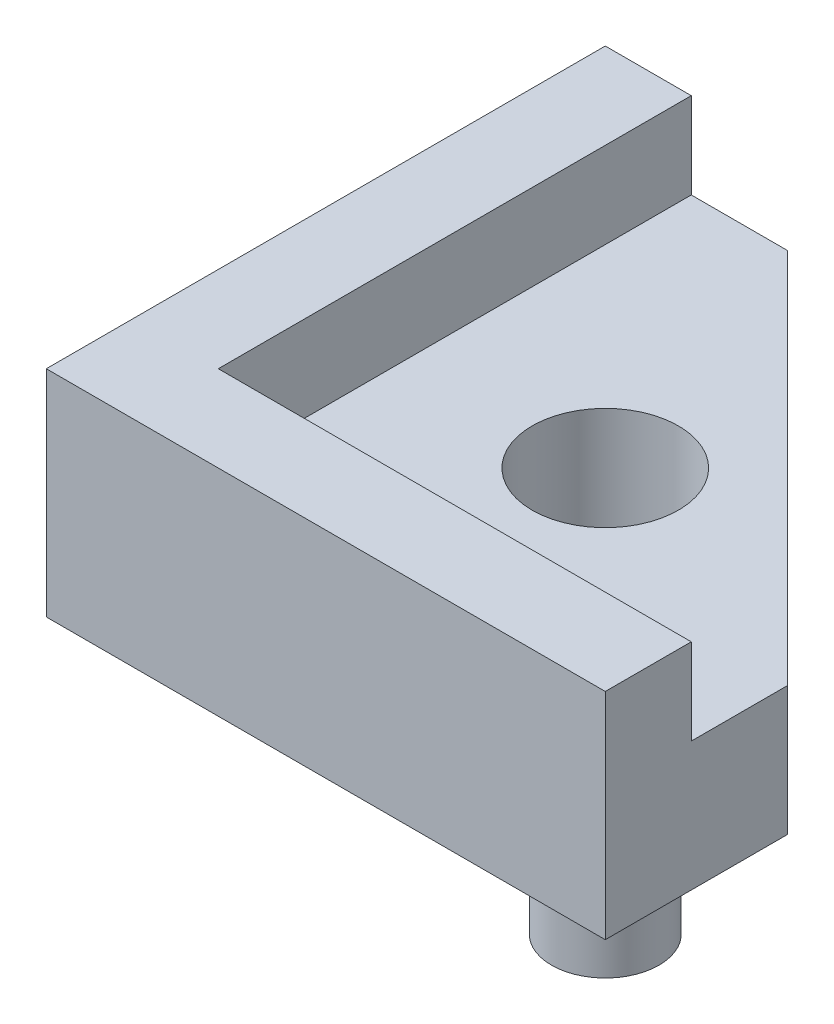
ISO-10303-21;
HEADER;
FILE_DESCRIPTION(('STEP AP214'),'2;1');
FILE_NAME('part.step','',(''),(''),'','','');
FILE_SCHEMA(('AUTOMOTIVE_DESIGN { 1 0 10303 214 1 1 1 1 }'));
ENDSEC;
DATA;
#1=APPLICATION_CONTEXT('core data for automotive mechanical design processes');
#2=APPLICATION_PROTOCOL_DEFINITION('international standard','automotive_design',2000,#1);
#3=PRODUCT_CONTEXT('',#1,'mechanical');
#4=PRODUCT('Part','Part','',(#3));
#5=PRODUCT_RELATED_PRODUCT_CATEGORY('part','',(#4));
#6=PRODUCT_DEFINITION_FORMATION('','',#4);
#7=PRODUCT_DEFINITION_CONTEXT('part definition',#1,'design');
#8=PRODUCT_DEFINITION('design','',#6,#7);
#9=PRODUCT_DEFINITION_SHAPE('','',#8);
#10=(LENGTH_UNIT() NAMED_UNIT(*) SI_UNIT(.MILLI.,.METRE.));
#11=(NAMED_UNIT(*) PLANE_ANGLE_UNIT() SI_UNIT($,.RADIAN.));
#12=(NAMED_UNIT(*) SI_UNIT($,.STERADIAN.) SOLID_ANGLE_UNIT());
#13=UNCERTAINTY_MEASURE_WITH_UNIT(LENGTH_MEASURE(1.E-05),#10,'distance_accuracy_value','');
#14=(GEOMETRIC_REPRESENTATION_CONTEXT(3) GLOBAL_UNCERTAINTY_ASSIGNED_CONTEXT((#13)) GLOBAL_UNIT_ASSIGNED_CONTEXT((#10,
#11,#12)) REPRESENTATION_CONTEXT('',''));
#15=CARTESIAN_POINT('',(0.,0.,0.));
#16=DIRECTION('',(0.,0.,1.));
#17=DIRECTION('',(1.,0.,0.));
#18=AXIS2_PLACEMENT_3D('',#15,#16,#17);
#19=CARTESIAN_POINT('',(-2.5,-3.,2.5));
#20=DIRECTION('',(0.,0.,1.));
#21=DIRECTION('',(1.,0.,0.));
#22=AXIS2_PLACEMENT_3D('',#19,#20,#21);
#23=PLANE('',#22);
#24=DIRECTION('',(0.,1.,0.));
#25=VECTOR('',#24,1.);
#26=CARTESIAN_POINT('',(10.5,-3.,2.5));
#27=LINE('',#26,#25);
#28=CARTESIAN_POINT('',(10.5,-3.,2.5));
#29=VERTEX_POINT('',#28);
#30=CARTESIAN_POINT('',(10.5,2.,2.5));
#31=VERTEX_POINT('',#30);
#32=EDGE_CURVE('E196',#29,#31,#27,.T.);
#33=ORIENTED_EDGE('',*,*,#32,.T.);
#34=DIRECTION('',(1.,0.,0.));
#35=VECTOR('',#34,1.);
#36=CARTESIAN_POINT('',(-2.5,2.,2.5));
#37=LINE('',#36,#35);
#38=CARTESIAN_POINT('',(-2.5,2.,2.5));
#39=VERTEX_POINT('',#38);
#40=EDGE_CURVE('E132',#39,#31,#37,.T.);
#41=ORIENTED_EDGE('',*,*,#40,.F.);
#42=DIRECTION('',(0.,1.,0.));
#43=VECTOR('',#42,1.);
#44=CARTESIAN_POINT('',(-2.5,-3.,2.5));
#45=LINE('',#44,#43);
#46=CARTESIAN_POINT('',(-2.5,-3.,2.5));
#47=VERTEX_POINT('',#46);
#48=EDGE_CURVE('E122',#47,#39,#45,.T.);
#49=ORIENTED_EDGE('',*,*,#48,.F.);
#50=DIRECTION('',(1.,0.,0.));
#51=VECTOR('',#50,1.);
#52=CARTESIAN_POINT('',(-2.5,-3.,2.5));
#53=LINE('',#52,#51);
#54=EDGE_CURVE('E179',#47,#29,#53,.T.);
#55=ORIENTED_EDGE('',*,*,#54,.T.);
#56=EDGE_LOOP('',(#33,#41,#49,#55));
#57=FACE_BOUND('',#56,.T.);
#58=ADVANCED_FACE('F45',(#57),#23,.T.);
#59=CARTESIAN_POINT('',(-2.5,-3.,-10.5));
#60=DIRECTION('',(-1.,0.,0.));
#61=DIRECTION('',(0.,0.,1.));
#62=AXIS2_PLACEMENT_3D('',#59,#60,#61);
#63=PLANE('',#62);
#64=ORIENTED_EDGE('',*,*,#48,.T.);
#65=DIRECTION('',(0.,0.,1.));
#66=VECTOR('',#65,1.);
#67=CARTESIAN_POINT('',(-2.5,2.,-10.5));
#68=LINE('',#67,#66);
#69=CARTESIAN_POINT('',(-2.5,2.,-10.5));
#70=VERTEX_POINT('',#69);
#71=EDGE_CURVE('E126',#70,#39,#68,.T.);
#72=ORIENTED_EDGE('',*,*,#71,.F.);
#73=DIRECTION('',(0.,1.,0.));
#74=VECTOR('',#73,1.);
#75=CARTESIAN_POINT('',(-2.5,-3.,-10.5));
#76=LINE('',#75,#74);
#77=CARTESIAN_POINT('',(-2.5,-3.,-10.5));
#78=VERTEX_POINT('',#77);
#79=EDGE_CURVE('E110',#78,#70,#76,.T.);
#80=ORIENTED_EDGE('',*,*,#79,.F.);
#81=DIRECTION('',(0.,0.,1.));
#82=VECTOR('',#81,1.);
#83=CARTESIAN_POINT('',(-2.5,-3.,-10.5));
#84=LINE('',#83,#82);
#85=EDGE_CURVE('E193',#78,#47,#84,.T.);
#86=ORIENTED_EDGE('',*,*,#85,.T.);
#87=EDGE_LOOP('',(#64,#72,#80,#86));
#88=FACE_BOUND('',#87,.T.);
#89=ADVANCED_FACE('F127',(#88),#63,.T.);
#90=CARTESIAN_POINT('',(1.74264068711924,-3.,-10.5));
#91=DIRECTION('',(0.,0.,-1.));
#92=DIRECTION('',(-1.,0.,0.));
#93=AXIS2_PLACEMENT_3D('',#90,#91,#92);
#94=PLANE('',#93);
#95=DIRECTION('',(-1.,0.,0.));
#96=VECTOR('',#95,1.);
#97=CARTESIAN_POINT('',(1.74264068711924,0.,-10.5));
#98=LINE('',#97,#96);
#99=CARTESIAN_POINT('',(1.74264068711924,0.,-10.5));
#100=VERTEX_POINT('',#99);
#101=CARTESIAN_POINT('',(-0.5,0.,-10.5));
#102=VERTEX_POINT('',#101);
#103=EDGE_CURVE('E60',#100,#102,#98,.T.);
#104=ORIENTED_EDGE('',*,*,#103,.F.);
#105=DIRECTION('',(0.,1.,0.));
#106=VECTOR('',#105,1.);
#107=CARTESIAN_POINT('',(1.74264068711924,-3.,-10.5));
#108=LINE('',#107,#106);
#109=CARTESIAN_POINT('',(1.74264068711924,-3.,-10.5));
#110=VERTEX_POINT('',#109);
#111=EDGE_CURVE('E123',#110,#100,#108,.T.);
#112=ORIENTED_EDGE('',*,*,#111,.F.);
#113=DIRECTION('',(-1.,0.,0.));
#114=VECTOR('',#113,1.);
#115=CARTESIAN_POINT('',(1.74264068711924,-3.,-10.5));
#116=LINE('',#115,#114);
#117=EDGE_CURVE('E117',#110,#78,#116,.T.);
#118=ORIENTED_EDGE('',*,*,#117,.T.);
#119=ORIENTED_EDGE('',*,*,#79,.T.);
#120=DIRECTION('',(-1.,0.,0.));
#121=VECTOR('',#120,1.);
#122=CARTESIAN_POINT('',(-0.5,2.,-10.5));
#123=LINE('',#122,#121);
#124=CARTESIAN_POINT('',(-0.5,2.,-10.5));
#125=VERTEX_POINT('',#124);
#126=EDGE_CURVE('E115',#125,#70,#123,.T.);
#127=ORIENTED_EDGE('',*,*,#126,.F.);
#128=DIRECTION('',(0.,-1.,0.));
#129=VECTOR('',#128,1.);
#130=CARTESIAN_POINT('',(-0.5,2.,-10.5));
#131=LINE('',#130,#129);
#132=EDGE_CURVE('E157',#125,#102,#131,.T.);
#133=ORIENTED_EDGE('',*,*,#132,.T.);
#134=EDGE_LOOP('',(#104,#112,#118,#119,#127,#133));
#135=FACE_BOUND('',#134,.T.);
#136=ADVANCED_FACE('F112',(#135),#94,.T.);
#137=CARTESIAN_POINT('',(10.5,-3.,-1.74264068711933));
#138=DIRECTION('',(0.707106781186544,0.,-0.707106781186551));
#139=DIRECTION('',(-0.707106781186551,0.,-0.707106781186544));
#140=AXIS2_PLACEMENT_3D('',#137,#138,#139);
#141=PLANE('',#140);
#142=DIRECTION('',(-0.707106781186551,0.,-0.707106781186544));
#143=VECTOR('',#142,1.);
#144=CARTESIAN_POINT('',(10.5,0.,-1.74264068711933));
#145=LINE('',#144,#143);
#146=CARTESIAN_POINT('',(10.5,0.,-1.74264068711933));
#147=VERTEX_POINT('',#146);
#148=EDGE_CURVE('E199',#147,#100,#145,.T.);
#149=ORIENTED_EDGE('',*,*,#148,.F.);
#150=DIRECTION('',(0.,1.,0.));
#151=VECTOR('',#150,1.);
#152=CARTESIAN_POINT('',(10.5,-3.,-1.74264068711933));
#153=LINE('',#152,#151);
#154=CARTESIAN_POINT('',(10.5,-3.,-1.74264068711933));
#155=VERTEX_POINT('',#154);
#156=EDGE_CURVE('E208',#155,#147,#153,.T.);
#157=ORIENTED_EDGE('',*,*,#156,.F.);
#158=DIRECTION('',(-0.707106781186551,0.,-0.707106781186544));
#159=VECTOR('',#158,1.);
#160=CARTESIAN_POINT('',(10.5,-3.,-1.74264068711933));
#161=LINE('',#160,#159);
#162=EDGE_CURVE('E187',#155,#110,#161,.T.);
#163=ORIENTED_EDGE('',*,*,#162,.T.);
#164=ORIENTED_EDGE('',*,*,#111,.T.);
#165=EDGE_LOOP('',(#149,#157,#163,#164));
#166=FACE_BOUND('',#165,.T.);
#167=ADVANCED_FACE('F241',(#166),#141,.T.);
#168=CARTESIAN_POINT('',(10.5,-3.,2.5));
#169=DIRECTION('',(1.,0.,0.));
#170=DIRECTION('',(0.,0.,-1.));
#171=AXIS2_PLACEMENT_3D('',#168,#169,#170);
#172=PLANE('',#171);
#173=DIRECTION('',(0.,0.,-1.));
#174=VECTOR('',#173,1.);
#175=CARTESIAN_POINT('',(10.5,0.,2.5));
#176=LINE('',#175,#174);
#177=CARTESIAN_POINT('',(10.5,0.,0.500000000000001));
#178=VERTEX_POINT('',#177);
#179=EDGE_CURVE('E178',#178,#147,#176,.T.);
#180=ORIENTED_EDGE('',*,*,#179,.F.);
#181=DIRECTION('',(0.,-1.,0.));
#182=VECTOR('',#181,1.);
#183=CARTESIAN_POINT('',(10.5,2.,0.5));
#184=LINE('',#183,#182);
#185=CARTESIAN_POINT('',(10.5,2.,0.5));
#186=VERTEX_POINT('',#185);
#187=EDGE_CURVE('E166',#186,#178,#184,.T.);
#188=ORIENTED_EDGE('',*,*,#187,.F.);
#189=DIRECTION('',(0.,0.,-1.));
#190=VECTOR('',#189,1.);
#191=CARTESIAN_POINT('',(10.5,2.,2.5));
#192=LINE('',#191,#190);
#193=EDGE_CURVE('E149',#31,#186,#192,.T.);
#194=ORIENTED_EDGE('',*,*,#193,.F.);
#195=ORIENTED_EDGE('',*,*,#32,.F.);
#196=DIRECTION('',(0.,0.,-1.));
#197=VECTOR('',#196,1.);
#198=CARTESIAN_POINT('',(10.5,-3.,2.5));
#199=LINE('',#198,#197);
#200=EDGE_CURVE('E183',#29,#155,#199,.T.);
#201=ORIENTED_EDGE('',*,*,#200,.T.);
#202=ORIENTED_EDGE('',*,*,#156,.T.);
#203=EDGE_LOOP('',(#180,#188,#194,#195,#201,#202));
#204=FACE_BOUND('',#203,.T.);
#205=ADVANCED_FACE('F223',(#204),#172,.T.);
#206=CARTESIAN_POINT('',(0.,-3.,0.));
#207=DIRECTION('',(0.,1.,0.));
#208=DIRECTION('',(0.,0.,1.));
#209=AXIS2_PLACEMENT_3D('',#206,#207,#208);
#210=PLANE('',#209);
#211=CARTESIAN_POINT('',(4.,-3.,-4.));
#212=DIRECTION('',(0.,1.,0.));
#213=DIRECTION('',(0.,0.,1.));
#214=AXIS2_PLACEMENT_3D('',#211,#212,#213);
#215=CIRCLE('',#214,1.7);
#216=CARTESIAN_POINT('',(4.,-3.,-2.3));
#217=VERTEX_POINT('',#216);
#218=EDGE_CURVE('E144',#217,#217,#215,.F.);
#219=ORIENTED_EDGE('',*,*,#218,.F.);
#220=EDGE_LOOP('',(#219));
#221=FACE_BOUND('',#220,.T.);
#222=CARTESIAN_POINT('',(0.11091270347399,-3.,-7.88908729652601));
#223=DIRECTION('',(0.,1.,0.));
#224=DIRECTION('',(0.,0.,1.));
#225=AXIS2_PLACEMENT_3D('',#222,#223,#224);
#226=CIRCLE('',#225,1.25);
#227=CARTESIAN_POINT('',(0.11091270347399,-3.,-6.63908729652601));
#228=VERTEX_POINT('',#227);
#229=EDGE_CURVE('E11',#228,#228,#226,.F.);
#230=ORIENTED_EDGE('',*,*,#229,.F.);
#231=EDGE_LOOP('',(#230));
#232=FACE_BOUND('',#231,.T.);
#233=CARTESIAN_POINT('',(7.88908729652601,-3.,-0.110912703473988));
#234=DIRECTION('',(0.,1.,0.));
#235=DIRECTION('',(0.,0.,1.));
#236=AXIS2_PLACEMENT_3D('',#233,#234,#235);
#237=CIRCLE('',#236,1.25);
#238=CARTESIAN_POINT('',(7.88908729652601,-3.,1.13908729652601));
#239=VERTEX_POINT('',#238);
#240=EDGE_CURVE('E53',#239,#239,#237,.F.);
#241=ORIENTED_EDGE('',*,*,#240,.F.);
#242=EDGE_LOOP('',(#241));
#243=FACE_BOUND('',#242,.T.);
#244=ORIENTED_EDGE('',*,*,#54,.F.);
#245=ORIENTED_EDGE('',*,*,#85,.F.);
#246=ORIENTED_EDGE('',*,*,#117,.F.);
#247=ORIENTED_EDGE('',*,*,#162,.F.);
#248=ORIENTED_EDGE('',*,*,#200,.F.);
#249=EDGE_LOOP('',(#244,#245,#246,#247,#248));
#250=FACE_BOUND('',#249,.T.);
#251=ADVANCED_FACE('F219',(#221,#232,#243,#250),#210,.F.);
#252=CARTESIAN_POINT('',(0.,0.,0.));
#253=DIRECTION('',(0.,1.,0.));
#254=DIRECTION('',(0.,0.,1.));
#255=AXIS2_PLACEMENT_3D('',#252,#253,#254);
#256=PLANE('',#255);
#257=CARTESIAN_POINT('',(4.,0.,-4.));
#258=DIRECTION('',(0.,1.,0.));
#259=DIRECTION('',(0.,0.,1.));
#260=AXIS2_PLACEMENT_3D('',#257,#258,#259);
#261=CIRCLE('',#260,1.7);
#262=CARTESIAN_POINT('',(4.,0.,-2.3));
#263=VERTEX_POINT('',#262);
#264=EDGE_CURVE('E289',#263,#263,#261,.T.);
#265=ORIENTED_EDGE('',*,*,#264,.F.);
#266=EDGE_LOOP('',(#265));
#267=FACE_BOUND('',#266,.T.);
#268=DIRECTION('',(0.,0.,-1.));
#269=VECTOR('',#268,1.);
#270=CARTESIAN_POINT('',(-0.5,0.,0.500000000000001));
#271=LINE('',#270,#269);
#272=CARTESIAN_POINT('',(-0.5,0.,0.500000000000001));
#273=VERTEX_POINT('',#272);
#274=EDGE_CURVE('E139',#273,#102,#271,.T.);
#275=ORIENTED_EDGE('',*,*,#274,.F.);
#276=DIRECTION('',(-1.,0.,0.));
#277=VECTOR('',#276,1.);
#278=CARTESIAN_POINT('',(10.5,0.,0.5));
#279=LINE('',#278,#277);
#280=EDGE_CURVE('E66',#178,#273,#279,.T.);
#281=ORIENTED_EDGE('',*,*,#280,.F.);
#282=ORIENTED_EDGE('',*,*,#179,.T.);
#283=ORIENTED_EDGE('',*,*,#148,.T.);
#284=ORIENTED_EDGE('',*,*,#103,.T.);
#285=EDGE_LOOP('',(#275,#281,#282,#283,#284));
#286=FACE_BOUND('',#285,.T.);
#287=ADVANCED_FACE('F222',(#267,#286),#256,.T.);
#288=CARTESIAN_POINT('',(7.88908729652601,-5.5,-0.110912703473988));
#289=DIRECTION('',(0.,1.,0.));
#290=DIRECTION('',(0.,0.,1.));
#291=AXIS2_PLACEMENT_3D('',#288,#289,#290);
#292=CYLINDRICAL_SURFACE('',#291,1.25);
#293=CARTESIAN_POINT('',(7.88908729652601,-5.5,-0.110912703473988));
#294=DIRECTION('',(0.,-1.,0.));
#295=DIRECTION('',(0.,0.,-1.));
#296=AXIS2_PLACEMENT_3D('',#293,#294,#295);
#297=CIRCLE('',#296,1.25);
#298=CARTESIAN_POINT('',(7.88908729652601,-5.5,-1.36091270347399));
#299=VERTEX_POINT('',#298);
#300=EDGE_CURVE('E174',#299,#299,#297,.T.);
#301=ORIENTED_EDGE('',*,*,#300,.F.);
#302=EDGE_LOOP('',(#301));
#303=FACE_BOUND('',#302,.T.);
#304=ORIENTED_EDGE('',*,*,#240,.T.);
#305=EDGE_LOOP('',(#304));
#306=FACE_BOUND('',#305,.T.);
#307=ADVANCED_FACE('F217',(#303,#306),#292,.T.);
#308=CARTESIAN_POINT('',(7.88908729652601,-5.5,-0.110912703473988));
#309=DIRECTION('',(0.,-1.,0.));
#310=DIRECTION('',(0.,0.,-1.));
#311=AXIS2_PLACEMENT_3D('',#308,#309,#310);
#312=PLANE('',#311);
#313=ORIENTED_EDGE('',*,*,#300,.T.);
#314=EDGE_LOOP('',(#313));
#315=FACE_BOUND('',#314,.T.);
#316=ADVANCED_FACE('F263',(#315),#312,.T.);
#317=CARTESIAN_POINT('',(0.11091270347399,-5.5,-7.88908729652601));
#318=DIRECTION('',(0.,1.,0.));
#319=DIRECTION('',(0.,0.,1.));
#320=AXIS2_PLACEMENT_3D('',#317,#318,#319);
#321=CYLINDRICAL_SURFACE('',#320,1.25);
#322=CARTESIAN_POINT('',(0.11091270347399,-5.5,-7.88908729652601));
#323=DIRECTION('',(0.,-1.,0.));
#324=DIRECTION('',(0.,0.,-1.));
#325=AXIS2_PLACEMENT_3D('',#322,#323,#324);
#326=CIRCLE('',#325,1.25);
#327=CARTESIAN_POINT('',(0.11091270347399,-5.5,-9.13908729652601));
#328=VERTEX_POINT('',#327);
#329=EDGE_CURVE('E170',#328,#328,#326,.T.);
#330=ORIENTED_EDGE('',*,*,#329,.F.);
#331=EDGE_LOOP('',(#330));
#332=FACE_BOUND('',#331,.T.);
#333=ORIENTED_EDGE('',*,*,#229,.T.);
#334=EDGE_LOOP('',(#333));
#335=FACE_BOUND('',#334,.T.);
#336=ADVANCED_FACE('F267',(#332,#335),#321,.T.);
#337=CARTESIAN_POINT('',(0.11091270347399,-5.5,-7.88908729652601));
#338=DIRECTION('',(0.,-1.,0.));
#339=DIRECTION('',(0.,0.,-1.));
#340=AXIS2_PLACEMENT_3D('',#337,#338,#339);
#341=PLANE('',#340);
#342=ORIENTED_EDGE('',*,*,#329,.T.);
#343=EDGE_LOOP('',(#342));
#344=FACE_BOUND('',#343,.T.);
#345=ADVANCED_FACE('F269',(#344),#341,.T.);
#346=CARTESIAN_POINT('',(10.5,2.,0.5));
#347=DIRECTION('',(0.,0.,1.));
#348=DIRECTION('',(1.,0.,0.));
#349=AXIS2_PLACEMENT_3D('',#346,#347,#348);
#350=PLANE('',#349);
#351=ORIENTED_EDGE('',*,*,#280,.T.);
#352=DIRECTION('',(0.,-1.,0.));
#353=VECTOR('',#352,1.);
#354=CARTESIAN_POINT('',(-0.5,2.,0.500000000000001));
#355=LINE('',#354,#353);
#356=CARTESIAN_POINT('',(-0.5,2.,0.500000000000001));
#357=VERTEX_POINT('',#356);
#358=EDGE_CURVE('E162',#357,#273,#355,.T.);
#359=ORIENTED_EDGE('',*,*,#358,.F.);
#360=DIRECTION('',(-1.,0.,0.));
#361=VECTOR('',#360,1.);
#362=CARTESIAN_POINT('',(10.5,2.,0.5));
#363=LINE('',#362,#361);
#364=EDGE_CURVE('E152',#186,#357,#363,.T.);
#365=ORIENTED_EDGE('',*,*,#364,.F.);
#366=ORIENTED_EDGE('',*,*,#187,.T.);
#367=EDGE_LOOP('',(#351,#359,#365,#366));
#368=FACE_BOUND('',#367,.T.);
#369=ADVANCED_FACE('F236',(#368),#350,.F.);
#370=CARTESIAN_POINT('',(-0.5,2.,0.500000000000001));
#371=DIRECTION('',(-1.,0.,0.));
#372=DIRECTION('',(0.,0.,1.));
#373=AXIS2_PLACEMENT_3D('',#370,#371,#372);
#374=PLANE('',#373);
#375=ORIENTED_EDGE('',*,*,#274,.T.);
#376=ORIENTED_EDGE('',*,*,#132,.F.);
#377=DIRECTION('',(0.,0.,-1.));
#378=VECTOR('',#377,1.);
#379=CARTESIAN_POINT('',(-0.5,2.,0.500000000000001));
#380=LINE('',#379,#378);
#381=EDGE_CURVE('E136',#357,#125,#380,.T.);
#382=ORIENTED_EDGE('',*,*,#381,.F.);
#383=ORIENTED_EDGE('',*,*,#358,.T.);
#384=EDGE_LOOP('',(#375,#376,#382,#383));
#385=FACE_BOUND('',#384,.T.);
#386=ADVANCED_FACE('F238',(#385),#374,.F.);
#387=CARTESIAN_POINT('',(0.,2.,0.));
#388=DIRECTION('',(0.,1.,0.));
#389=DIRECTION('',(0.,0.,1.));
#390=AXIS2_PLACEMENT_3D('',#387,#388,#389);
#391=PLANE('',#390);
#392=ORIENTED_EDGE('',*,*,#126,.T.);
#393=ORIENTED_EDGE('',*,*,#71,.T.);
#394=ORIENTED_EDGE('',*,*,#40,.T.);
#395=ORIENTED_EDGE('',*,*,#193,.T.);
#396=ORIENTED_EDGE('',*,*,#364,.T.);
#397=ORIENTED_EDGE('',*,*,#381,.T.);
#398=EDGE_LOOP('',(#392,#393,#394,#395,#396,#397));
#399=FACE_BOUND('',#398,.T.);
#400=ADVANCED_FACE('F134',(#399),#391,.T.);
#401=CARTESIAN_POINT('',(4.,-5.501,-4.));
#402=DIRECTION('',(0.,1.,0.));
#403=DIRECTION('',(0.,0.,1.));
#404=AXIS2_PLACEMENT_3D('',#401,#402,#403);
#405=CYLINDRICAL_SURFACE('',#404,1.7);
#406=CARTESIAN_POINT('',(4.,0.,-2.3));
#407=CARTESIAN_POINT('',(4.,-0.03125,-2.3));
#408=CARTESIAN_POINT('',(4.,-0.0625000000000001,-2.3));
#409=CARTESIAN_POINT('',(4.,-0.125,-2.3));
#410=CARTESIAN_POINT('',(4.,-0.15625,-2.3));
#411=CARTESIAN_POINT('',(4.,-0.21875,-2.3));
#412=CARTESIAN_POINT('',(4.,-0.25,-2.3));
#413=CARTESIAN_POINT('',(4.,-0.3125,-2.3));
#414=CARTESIAN_POINT('',(4.,-0.34375,-2.3));
#415=CARTESIAN_POINT('',(4.,-0.40625,-2.3));
#416=CARTESIAN_POINT('',(4.,-0.4375,-2.3));
#417=CARTESIAN_POINT('',(4.,-0.5,-2.3));
#418=CARTESIAN_POINT('',(4.,-0.53125,-2.3));
#419=CARTESIAN_POINT('',(4.,-0.593750000000001,-2.3));
#420=CARTESIAN_POINT('',(4.,-0.625000000000001,-2.3));
#421=CARTESIAN_POINT('',(4.,-0.687500000000001,-2.3));
#422=CARTESIAN_POINT('',(4.,-0.718750000000001,-2.3));
#423=CARTESIAN_POINT('',(4.,-0.781250000000001,-2.3));
#424=CARTESIAN_POINT('',(4.,-0.812500000000001,-2.3));
#425=CARTESIAN_POINT('',(4.,-0.875,-2.3));
#426=CARTESIAN_POINT('',(4.,-0.90625,-2.3));
#427=CARTESIAN_POINT('',(4.,-0.96875,-2.3));
#428=CARTESIAN_POINT('',(4.,-1.,-2.3));
#429=CARTESIAN_POINT('',(4.,-1.0625,-2.3));
#430=CARTESIAN_POINT('',(4.,-1.09375,-2.3));
#431=CARTESIAN_POINT('',(4.,-1.15625,-2.3));
#432=CARTESIAN_POINT('',(4.,-1.1875,-2.3));
#433=CARTESIAN_POINT('',(4.,-1.25,-2.3));
#434=CARTESIAN_POINT('',(4.,-1.28125,-2.3));
#435=CARTESIAN_POINT('',(4.,-1.34375,-2.3));
#436=CARTESIAN_POINT('',(4.,-1.375,-2.3));
#437=CARTESIAN_POINT('',(4.,-1.4375,-2.3));
#438=CARTESIAN_POINT('',(4.,-1.46875,-2.3));
#439=CARTESIAN_POINT('',(4.,-1.53125,-2.3));
#440=CARTESIAN_POINT('',(4.,-1.5625,-2.3));
#441=CARTESIAN_POINT('',(4.,-1.625,-2.3));
#442=CARTESIAN_POINT('',(4.,-1.65625,-2.3));
#443=CARTESIAN_POINT('',(4.,-1.71875,-2.3));
#444=CARTESIAN_POINT('',(4.,-1.75,-2.3));
#445=CARTESIAN_POINT('',(4.,-1.8125,-2.3));
#446=CARTESIAN_POINT('',(4.,-1.84375,-2.3));
#447=CARTESIAN_POINT('',(4.,-1.90625,-2.3));
#448=CARTESIAN_POINT('',(4.,-1.9375,-2.3));
#449=CARTESIAN_POINT('',(4.,-2.,-2.3));
#450=CARTESIAN_POINT('',(4.,-2.03125,-2.3));
#451=CARTESIAN_POINT('',(4.,-2.09375,-2.3));
#452=CARTESIAN_POINT('',(4.,-2.125,-2.3));
#453=CARTESIAN_POINT('',(4.,-2.1875,-2.3));
#454=CARTESIAN_POINT('',(4.,-2.21875,-2.3));
#455=CARTESIAN_POINT('',(4.,-2.28125,-2.3));
#456=CARTESIAN_POINT('',(4.,-2.3125,-2.3));
#457=CARTESIAN_POINT('',(4.,-2.375,-2.3));
#458=CARTESIAN_POINT('',(4.,-2.40625,-2.3));
#459=CARTESIAN_POINT('',(4.,-2.46875,-2.3));
#460=CARTESIAN_POINT('',(4.,-2.5,-2.3));
#461=CARTESIAN_POINT('',(4.,-2.5625,-2.3));
#462=CARTESIAN_POINT('',(4.,-2.59375,-2.3));
#463=CARTESIAN_POINT('',(4.,-2.65625,-2.3));
#464=CARTESIAN_POINT('',(4.,-2.6875,-2.3));
#465=CARTESIAN_POINT('',(4.,-2.75,-2.3));
#466=CARTESIAN_POINT('',(4.,-2.78125,-2.3));
#467=CARTESIAN_POINT('',(4.,-2.84375,-2.3));
#468=CARTESIAN_POINT('',(4.,-2.875,-2.3));
#469=CARTESIAN_POINT('',(4.,-2.9375,-2.3));
#470=CARTESIAN_POINT('',(4.,-2.96875,-2.3));
#471=CARTESIAN_POINT('',(4.,-3.,-2.3));
#472=B_SPLINE_CURVE_WITH_KNOTS('',3,(#406,#407,#408,#409,#410,#411,#412,#413,#414,#415,#416,
#417,#418,#419,#420,#421,#422,#423,#424,#425,#426,#427,#428,#429,#430,#431,#432,#433,#434,#435,
#436,#437,#438,#439,#440,#441,#442,#443,#444,#445,#446,#447,#448,#449,#450,#451,#452,#453,#454,
#455,#456,#457,#458,#459,#460,#461,#462,#463,#464,#465,#466,#467,#468,#469,#470,#471),
.UNSPECIFIED.,.F.,.F.,(4,2,2,2,2,2,2,2,2,2,2,2,2,2,2,2,2,2,2,2,2,2,2,2,2,2,2,2,2,2,2,2,4),(0.,
0.0937500000000001,0.1875,0.28125,0.375,0.46875,0.5625,0.656250000000001,0.750000000000001,
0.843750000000001,0.9375,1.03125,1.125,1.21875,1.3125,1.40625,1.5,1.59375,1.6875,1.78125,1.875,
1.96875,2.0625,2.15625,2.25,2.34375,2.4375,2.53125,2.625,2.71875,2.8125,2.90625,3.),.UNSPECIFIED.);
#473=EDGE_CURVE('BSEAM281',#263,#217,#472,.T.);
#474=ORIENTED_EDGE('',*,*,#264,.T.);
#475=ORIENTED_EDGE('',*,*,#218,.T.);
#476=ORIENTED_EDGE('',*,*,#473,.T.);
#477=ORIENTED_EDGE('',*,*,#473,.F.);
#478=EDGE_LOOP('',(#474,#476,#475,#477));
#479=FACE_BOUND('',#478,.T.);
#480=ADVANCED_FACE('F281',(#479),#405,.F.);
#481=CLOSED_SHELL('',(#58,#89,#136,#167,#205,#251,#287,#307,#316,#336,#345,#369,#386,#400,#480));
#482=MANIFOLD_SOLID_BREP('B2',#481);
#483=ADVANCED_BREP_SHAPE_REPRESENTATION('',(#18,#482),#14);
#484=SHAPE_DEFINITION_REPRESENTATION(#9,#483);
ENDSEC;
END-ISO-10303-21;
